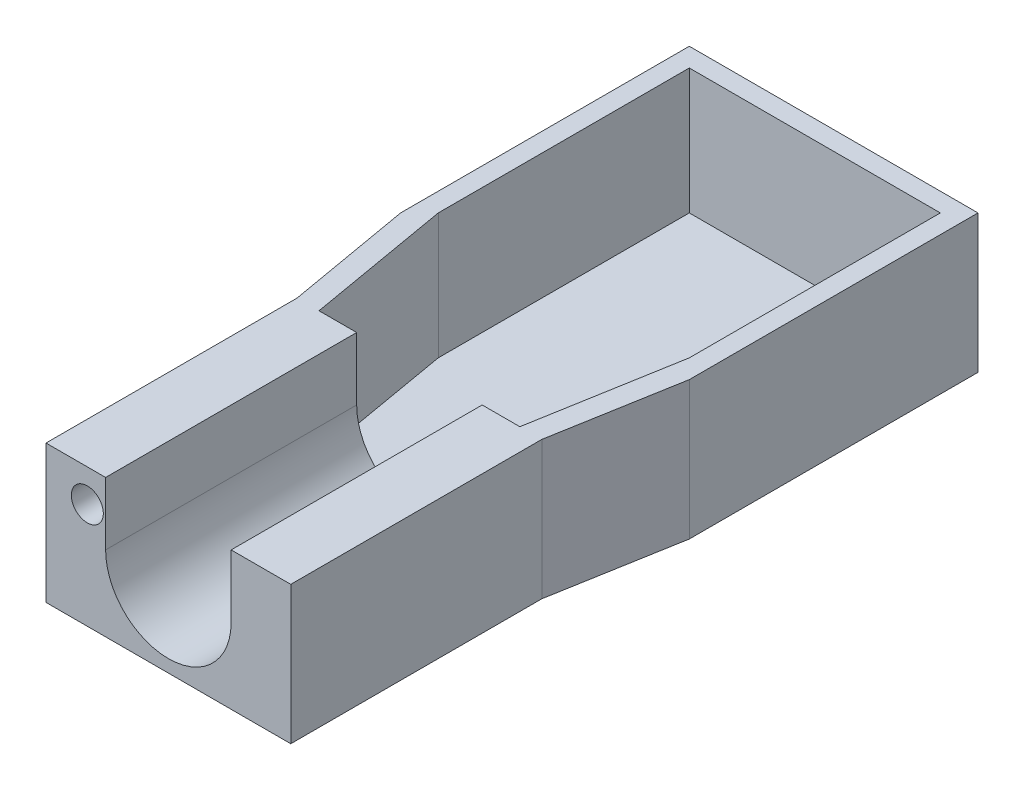
ISO-10303-21;
HEADER;
FILE_DESCRIPTION(('STEP AP214'),'2;1');
FILE_NAME('part.step','',(''),(''),'','','');
FILE_SCHEMA(('AUTOMOTIVE_DESIGN { 1 0 10303 214 1 1 1 1 }'));
ENDSEC;
DATA;
#1=APPLICATION_CONTEXT('core data for automotive mechanical design processes');
#2=APPLICATION_PROTOCOL_DEFINITION('international standard','automotive_design',2000,#1);
#3=PRODUCT_CONTEXT('',#1,'mechanical');
#4=PRODUCT('Part','Part','',(#3));
#5=PRODUCT_RELATED_PRODUCT_CATEGORY('part','',(#4));
#6=PRODUCT_DEFINITION_FORMATION('','',#4);
#7=PRODUCT_DEFINITION_CONTEXT('part definition',#1,'design');
#8=PRODUCT_DEFINITION('design','',#6,#7);
#9=PRODUCT_DEFINITION_SHAPE('','',#8);
#10=(LENGTH_UNIT() NAMED_UNIT(*) SI_UNIT(.MILLI.,.METRE.));
#11=(NAMED_UNIT(*) PLANE_ANGLE_UNIT() SI_UNIT($,.RADIAN.));
#12=(NAMED_UNIT(*) SI_UNIT($,.STERADIAN.) SOLID_ANGLE_UNIT());
#13=UNCERTAINTY_MEASURE_WITH_UNIT(LENGTH_MEASURE(1.E-05),#10,'distance_accuracy_value','');
#14=(GEOMETRIC_REPRESENTATION_CONTEXT(3) GLOBAL_UNCERTAINTY_ASSIGNED_CONTEXT((#13)) GLOBAL_UNIT_ASSIGNED_CONTEXT((#10,
#11,#12)) REPRESENTATION_CONTEXT('',''));
#15=CARTESIAN_POINT('',(0.,0.,0.));
#16=DIRECTION('',(0.,0.,1.));
#17=DIRECTION('',(1.,0.,0.));
#18=AXIS2_PLACEMENT_3D('',#15,#16,#17);
#19=CARTESIAN_POINT('',(0.,0.,0.));
#20=DIRECTION('',(0.,1.,0.));
#21=DIRECTION('',(0.,0.,1.));
#22=AXIS2_PLACEMENT_3D('',#19,#20,#21);
#23=PLANE('',#22);
#24=DIRECTION('',(0.171341174751248,0.,0.985211754819675));
#25=VECTOR('',#24,1.);
#26=CARTESIAN_POINT('',(-22.7889908256881,0.,3.96330275229359));
#27=LINE('',#26,#25);
#28=CARTESIAN_POINT('',(-20.,0.,20.));
#29=VERTEX_POINT('',#28);
#30=CARTESIAN_POINT('',(-16.,0.,43.));
#31=VERTEX_POINT('',#30);
#32=EDGE_CURVE('E186',#29,#31,#27,.T.);
#33=ORIENTED_EDGE('',*,*,#32,.T.);
#34=DIRECTION('',(-1.,0.,0.));
#35=VECTOR('',#34,1.);
#36=CARTESIAN_POINT('',(16.,0.,43.));
#37=LINE('',#36,#35);
#38=CARTESIAN_POINT('',(1.59588101442073E-12,0.,43.));
#39=VERTEX_POINT('',#38);
#40=EDGE_CURVE('E51',#39,#31,#37,.T.);
#41=ORIENTED_EDGE('',*,*,#40,.F.);
#42=CARTESIAN_POINT('',(16.,0.,43.));
#43=VERTEX_POINT('',#42);
#44=EDGE_CURVE('E163',#43,#39,#37,.T.);
#45=ORIENTED_EDGE('',*,*,#44,.F.);
#46=DIRECTION('',(-0.171341174751247,0.,0.985211754819675));
#47=VECTOR('',#46,1.);
#48=CARTESIAN_POINT('',(22.7889908256881,0.,3.96330275229357));
#49=LINE('',#48,#47);
#50=CARTESIAN_POINT('',(20.,0.,20.));
#51=VERTEX_POINT('',#50);
#52=EDGE_CURVE('E167',#51,#43,#49,.T.);
#53=ORIENTED_EDGE('',*,*,#52,.F.);
#54=DIRECTION('',(0.,0.,-1.));
#55=VECTOR('',#54,1.);
#56=CARTESIAN_POINT('',(20.,0.,-20.));
#57=LINE('',#56,#55);
#58=CARTESIAN_POINT('',(20.,0.,-20.));
#59=VERTEX_POINT('',#58);
#60=EDGE_CURVE('E220',#51,#59,#57,.T.);
#61=ORIENTED_EDGE('',*,*,#60,.T.);
#62=DIRECTION('',(-1.,0.,0.));
#63=VECTOR('',#62,1.);
#64=CARTESIAN_POINT('',(-20.,0.,-20.));
#65=LINE('',#64,#63);
#66=CARTESIAN_POINT('',(-20.,0.,-20.));
#67=VERTEX_POINT('',#66);
#68=EDGE_CURVE('E230',#59,#67,#65,.T.);
#69=ORIENTED_EDGE('',*,*,#68,.T.);
#70=DIRECTION('',(0.,0.,1.));
#71=VECTOR('',#70,1.);
#72=CARTESIAN_POINT('',(-20.,0.,-20.));
#73=LINE('',#72,#71);
#74=EDGE_CURVE('E224',#67,#29,#73,.T.);
#75=ORIENTED_EDGE('',*,*,#74,.T.);
#76=EDGE_LOOP('',(#33,#41,#45,#53,#61,#69,#75));
#77=FACE_BOUND('',#76,.T.);
#78=ADVANCED_FACE('F36',(#77),#23,.T.);
#79=CARTESIAN_POINT('',(-22.7889908256881,-2.,3.96330275229359));
#80=DIRECTION('',(-0.985211754819675,0.,0.171341174751248));
#81=DIRECTION('',(0.171341174751248,0.,0.985211754819674));
#82=AXIS2_PLACEMENT_3D('',#79,#80,#81);
#83=PLANE('',#82);
#84=DIRECTION('',(0.,1.,0.));
#85=VECTOR('',#84,1.);
#86=CARTESIAN_POINT('',(-16.,-2.,43.));
#87=LINE('',#86,#85);
#88=CARTESIAN_POINT('',(-16.,20.,43.));
#89=VERTEX_POINT('',#88);
#90=EDGE_CURVE('E207',#31,#89,#87,.T.);
#91=ORIENTED_EDGE('',*,*,#90,.F.);
#92=ORIENTED_EDGE('',*,*,#32,.F.);
#93=DIRECTION('',(0.,-1.,0.));
#94=VECTOR('',#93,1.);
#95=CARTESIAN_POINT('',(-20.,20.,20.));
#96=LINE('',#95,#94);
#97=CARTESIAN_POINT('',(-20.,20.,20.));
#98=VERTEX_POINT('',#97);
#99=EDGE_CURVE('E236',#98,#29,#96,.T.);
#100=ORIENTED_EDGE('',*,*,#99,.F.);
#101=DIRECTION('',(0.171341174751248,0.,0.985211754819675));
#102=VECTOR('',#101,1.);
#103=CARTESIAN_POINT('',(-22.7889908256881,20.,3.96330275229359));
#104=LINE('',#103,#102);
#105=EDGE_CURVE('E203',#98,#89,#104,.T.);
#106=ORIENTED_EDGE('',*,*,#105,.T.);
#107=EDGE_LOOP('',(#91,#92,#100,#106));
#108=FACE_BOUND('',#107,.T.);
#109=ADVANCED_FACE('F310',(#108),#83,.F.);
#110=CARTESIAN_POINT('',(22.7889908256881,-2.,3.96330275229357));
#111=DIRECTION('',(-0.985211754819675,0.,-0.171341174751247));
#112=DIRECTION('',(-0.171341174751247,0.,0.985211754819675));
#113=AXIS2_PLACEMENT_3D('',#110,#111,#112);
#114=PLANE('',#113);
#115=ORIENTED_EDGE('',*,*,#52,.T.);
#116=DIRECTION('',(0.,1.,0.));
#117=VECTOR('',#116,1.);
#118=CARTESIAN_POINT('',(16.,-2.,43.));
#119=LINE('',#118,#117);
#120=CARTESIAN_POINT('',(16.,20.,43.));
#121=VERTEX_POINT('',#120);
#122=EDGE_CURVE('E173',#43,#121,#119,.T.);
#123=ORIENTED_EDGE('',*,*,#122,.T.);
#124=DIRECTION('',(-0.171341174751247,0.,0.985211754819675));
#125=VECTOR('',#124,1.);
#126=CARTESIAN_POINT('',(22.7889908256881,20.,3.96330275229357));
#127=LINE('',#126,#125);
#128=CARTESIAN_POINT('',(20.,20.,20.));
#129=VERTEX_POINT('',#128);
#130=EDGE_CURVE('E194',#129,#121,#127,.T.);
#131=ORIENTED_EDGE('',*,*,#130,.F.);
#132=DIRECTION('',(0.,-1.,0.));
#133=VECTOR('',#132,1.);
#134=CARTESIAN_POINT('',(20.,20.,20.));
#135=LINE('',#134,#133);
#136=EDGE_CURVE('E185',#129,#51,#135,.T.);
#137=ORIENTED_EDGE('',*,*,#136,.T.);
#138=EDGE_LOOP('',(#115,#123,#131,#137));
#139=FACE_BOUND('',#138,.T.);
#140=ADVANCED_FACE('F183',(#139),#114,.T.);
#141=CARTESIAN_POINT('',(0.,20.,0.));
#142=DIRECTION('',(0.,1.,0.));
#143=DIRECTION('',(0.,0.,1.));
#144=AXIS2_PLACEMENT_3D('',#141,#142,#143);
#145=PLANE('',#144);
#146=DIRECTION('',(0.,0.,-1.));
#147=VECTOR('',#146,1.);
#148=CARTESIAN_POINT('',(20.,20.,-20.));
#149=LINE('',#148,#147);
#150=CARTESIAN_POINT('',(20.,20.,-20.));
#151=VERTEX_POINT('',#150);
#152=EDGE_CURVE('E221',#129,#151,#149,.T.);
#153=ORIENTED_EDGE('',*,*,#152,.F.);
#154=ORIENTED_EDGE('',*,*,#130,.T.);
#155=DIRECTION('',(1.,0.,0.));
#156=VECTOR('',#155,1.);
#157=CARTESIAN_POINT('',(0.,20.,43.));
#158=LINE('',#157,#156);
#159=CARTESIAN_POINT('',(10.,20.,43.));
#160=VERTEX_POINT('',#159);
#161=EDGE_CURVE('E177',#160,#121,#158,.T.);
#162=ORIENTED_EDGE('',*,*,#161,.F.);
#163=DIRECTION('',(0.,0.,-1.));
#164=VECTOR('',#163,1.);
#165=CARTESIAN_POINT('',(10.,20.,83.));
#166=LINE('',#165,#164);
#167=CARTESIAN_POINT('',(10.,20.,83.));
#168=VERTEX_POINT('',#167);
#169=EDGE_CURVE('E282',#168,#160,#166,.T.);
#170=ORIENTED_EDGE('',*,*,#169,.F.);
#171=DIRECTION('',(1.,0.,0.));
#172=VECTOR('',#171,1.);
#173=CARTESIAN_POINT('',(0.,20.,83.));
#174=LINE('',#173,#172);
#175=CARTESIAN_POINT('',(19.5,20.,83.));
#176=VERTEX_POINT('',#175);
#177=EDGE_CURVE('E277',#168,#176,#174,.T.);
#178=ORIENTED_EDGE('',*,*,#177,.T.);
#179=DIRECTION('',(0.,0.,-1.));
#180=VECTOR('',#179,1.);
#181=CARTESIAN_POINT('',(19.5,20.,83.));
#182=LINE('',#181,#180);
#183=CARTESIAN_POINT('',(19.5,20.,43.));
#184=VERTEX_POINT('',#183);
#185=EDGE_CURVE('E275',#176,#184,#182,.T.);
#186=ORIENTED_EDGE('',*,*,#185,.T.);
#187=DIRECTION('',(0.172380331752248,0.,-0.985030467155704));
#188=VECTOR('',#187,1.);
#189=CARTESIAN_POINT('',(26.2219526986052,20.,4.58884172225589));
#190=LINE('',#189,#188);
#191=CARTESIAN_POINT('',(23.,20.,23.));
#192=VERTEX_POINT('',#191);
#193=EDGE_CURVE('E188',#184,#192,#190,.T.);
#194=ORIENTED_EDGE('',*,*,#193,.T.);
#195=DIRECTION('',(0.,0.,-1.));
#196=VECTOR('',#195,1.);
#197=CARTESIAN_POINT('',(23.,20.,-23.));
#198=LINE('',#197,#196);
#199=CARTESIAN_POINT('',(23.,20.,-23.));
#200=VERTEX_POINT('',#199);
#201=EDGE_CURVE('E244',#192,#200,#198,.T.);
#202=ORIENTED_EDGE('',*,*,#201,.T.);
#203=DIRECTION('',(-1.,0.,0.));
#204=VECTOR('',#203,1.);
#205=CARTESIAN_POINT('',(-23.,20.,-23.));
#206=LINE('',#205,#204);
#207=CARTESIAN_POINT('',(-23.,20.,-23.));
#208=VERTEX_POINT('',#207);
#209=EDGE_CURVE('E247',#200,#208,#206,.T.);
#210=ORIENTED_EDGE('',*,*,#209,.T.);
#211=DIRECTION('',(0.,0.,1.));
#212=VECTOR('',#211,1.);
#213=CARTESIAN_POINT('',(-23.,20.,-23.));
#214=LINE('',#213,#212);
#215=CARTESIAN_POINT('',(-23.,20.,23.));
#216=VERTEX_POINT('',#215);
#217=EDGE_CURVE('E59',#208,#216,#214,.T.);
#218=ORIENTED_EDGE('',*,*,#217,.T.);
#219=DIRECTION('',(0.172380331752249,0.,0.985030467155704));
#220=VECTOR('',#219,1.);
#221=CARTESIAN_POINT('',(-26.2219526986052,20.,4.58884172225593));
#222=LINE('',#221,#220);
#223=CARTESIAN_POINT('',(-19.5,20.,43.));
#224=VERTEX_POINT('',#223);
#225=EDGE_CURVE('E180',#216,#224,#222,.T.);
#226=ORIENTED_EDGE('',*,*,#225,.T.);
#227=DIRECTION('',(0.,0.,-1.));
#228=VECTOR('',#227,1.);
#229=CARTESIAN_POINT('',(-19.5,20.,83.));
#230=LINE('',#229,#228);
#231=CARTESIAN_POINT('',(-19.5,20.,83.));
#232=VERTEX_POINT('',#231);
#233=EDGE_CURVE('E293',#232,#224,#230,.T.);
#234=ORIENTED_EDGE('',*,*,#233,.F.);
#235=DIRECTION('',(-1.,0.,0.));
#236=VECTOR('',#235,1.);
#237=CARTESIAN_POINT('',(0.,20.,83.));
#238=LINE('',#237,#236);
#239=CARTESIAN_POINT('',(-9.99999999999787,20.,83.));
#240=VERTEX_POINT('',#239);
#241=EDGE_CURVE('E351',#240,#232,#238,.T.);
#242=ORIENTED_EDGE('',*,*,#241,.F.);
#243=DIRECTION('',(0.,0.,-1.));
#244=VECTOR('',#243,1.);
#245=CARTESIAN_POINT('',(-9.99999999999787,20.,83.));
#246=LINE('',#245,#244);
#247=CARTESIAN_POINT('',(-9.99999999999787,20.,43.));
#248=VERTEX_POINT('',#247);
#249=EDGE_CURVE('E296',#240,#248,#246,.T.);
#250=ORIENTED_EDGE('',*,*,#249,.T.);
#251=DIRECTION('',(-1.,0.,0.));
#252=VECTOR('',#251,1.);
#253=CARTESIAN_POINT('',(0.,20.,43.));
#254=LINE('',#253,#252);
#255=EDGE_CURVE('E318',#248,#89,#254,.T.);
#256=ORIENTED_EDGE('',*,*,#255,.T.);
#257=ORIENTED_EDGE('',*,*,#105,.F.);
#258=DIRECTION('',(0.,0.,1.));
#259=VECTOR('',#258,1.);
#260=CARTESIAN_POINT('',(-20.,20.,-20.));
#261=LINE('',#260,#259);
#262=CARTESIAN_POINT('',(-20.,20.,-20.));
#263=VERTEX_POINT('',#262);
#264=EDGE_CURVE('E226',#263,#98,#261,.T.);
#265=ORIENTED_EDGE('',*,*,#264,.F.);
#266=DIRECTION('',(-1.,0.,0.));
#267=VECTOR('',#266,1.);
#268=CARTESIAN_POINT('',(-20.,20.,-20.));
#269=LINE('',#268,#267);
#270=EDGE_CURVE('E223',#151,#263,#269,.T.);
#271=ORIENTED_EDGE('',*,*,#270,.F.);
#272=EDGE_LOOP('',(#153,#154,#162,#170,#178,#186,#194,#202,#210,#218,#226,#234,#242,#250,#256,
#257,#265,#271));
#273=FACE_BOUND('',#272,.T.);
#274=ADVANCED_FACE('F273',(#273),#145,.T.);
#275=CARTESIAN_POINT('',(23.,20.,-23.));
#276=DIRECTION('',(-1.,0.,0.));
#277=DIRECTION('',(0.,0.,1.));
#278=AXIS2_PLACEMENT_3D('',#275,#276,#277);
#279=PLANE('',#278);
#280=DIRECTION('',(0.,-1.,0.));
#281=VECTOR('',#280,1.);
#282=CARTESIAN_POINT('',(23.,20.,23.));
#283=LINE('',#282,#281);
#284=CARTESIAN_POINT('',(23.,-2.,23.));
#285=VERTEX_POINT('',#284);
#286=EDGE_CURVE('E250',#192,#285,#283,.T.);
#287=ORIENTED_EDGE('',*,*,#286,.T.);
#288=DIRECTION('',(0.,0.,1.));
#289=VECTOR('',#288,1.);
#290=CARTESIAN_POINT('',(23.,-2.,-23.));
#291=LINE('',#290,#289);
#292=CARTESIAN_POINT('',(23.,-2.,-23.));
#293=VERTEX_POINT('',#292);
#294=EDGE_CURVE('E217',#293,#285,#291,.T.);
#295=ORIENTED_EDGE('',*,*,#294,.F.);
#296=DIRECTION('',(0.,-1.,0.));
#297=VECTOR('',#296,1.);
#298=CARTESIAN_POINT('',(23.,20.,-23.));
#299=LINE('',#298,#297);
#300=EDGE_CURVE('E44',#200,#293,#299,.T.);
#301=ORIENTED_EDGE('',*,*,#300,.F.);
#302=ORIENTED_EDGE('',*,*,#201,.F.);
#303=EDGE_LOOP('',(#287,#295,#301,#302));
#304=FACE_BOUND('',#303,.T.);
#305=ADVANCED_FACE('F38',(#304),#279,.F.);
#306=CARTESIAN_POINT('',(-23.,20.,-23.));
#307=DIRECTION('',(0.,0.,1.));
#308=DIRECTION('',(1.,0.,0.));
#309=AXIS2_PLACEMENT_3D('',#306,#307,#308);
#310=PLANE('',#309);
#311=ORIENTED_EDGE('',*,*,#300,.T.);
#312=DIRECTION('',(1.,0.,0.));
#313=VECTOR('',#312,1.);
#314=CARTESIAN_POINT('',(-23.,-2.,-23.));
#315=LINE('',#314,#313);
#316=CARTESIAN_POINT('',(-23.,-2.,-23.));
#317=VERTEX_POINT('',#316);
#318=EDGE_CURVE('E214',#317,#293,#315,.T.);
#319=ORIENTED_EDGE('',*,*,#318,.F.);
#320=DIRECTION('',(0.,-1.,0.));
#321=VECTOR('',#320,1.);
#322=CARTESIAN_POINT('',(-23.,20.,-23.));
#323=LINE('',#322,#321);
#324=EDGE_CURVE('E256',#208,#317,#323,.T.);
#325=ORIENTED_EDGE('',*,*,#324,.F.);
#326=ORIENTED_EDGE('',*,*,#209,.F.);
#327=EDGE_LOOP('',(#311,#319,#325,#326));
#328=FACE_BOUND('',#327,.T.);
#329=ADVANCED_FACE('F260',(#328),#310,.F.);
#330=CARTESIAN_POINT('',(-23.,20.,-23.));
#331=DIRECTION('',(1.,0.,0.));
#332=DIRECTION('',(0.,0.,-1.));
#333=AXIS2_PLACEMENT_3D('',#330,#331,#332);
#334=PLANE('',#333);
#335=ORIENTED_EDGE('',*,*,#324,.T.);
#336=DIRECTION('',(0.,0.,-1.));
#337=VECTOR('',#336,1.);
#338=CARTESIAN_POINT('',(-23.,-2.,-23.));
#339=LINE('',#338,#337);
#340=CARTESIAN_POINT('',(-23.,-2.,23.));
#341=VERTEX_POINT('',#340);
#342=EDGE_CURVE('E210',#341,#317,#339,.T.);
#343=ORIENTED_EDGE('',*,*,#342,.F.);
#344=DIRECTION('',(0.,-1.,0.));
#345=VECTOR('',#344,1.);
#346=CARTESIAN_POINT('',(-23.,20.,23.));
#347=LINE('',#346,#345);
#348=EDGE_CURVE('E253',#216,#341,#347,.T.);
#349=ORIENTED_EDGE('',*,*,#348,.F.);
#350=ORIENTED_EDGE('',*,*,#217,.F.);
#351=EDGE_LOOP('',(#335,#343,#349,#350));
#352=FACE_BOUND('',#351,.T.);
#353=ADVANCED_FACE('F401',(#352),#334,.F.);
#354=CARTESIAN_POINT('',(20.,20.,-20.));
#355=DIRECTION('',(-1.,0.,0.));
#356=DIRECTION('',(0.,0.,1.));
#357=AXIS2_PLACEMENT_3D('',#354,#355,#356);
#358=PLANE('',#357);
#359=ORIENTED_EDGE('',*,*,#60,.F.);
#360=ORIENTED_EDGE('',*,*,#136,.F.);
#361=ORIENTED_EDGE('',*,*,#152,.T.);
#362=DIRECTION('',(0.,-1.,0.));
#363=VECTOR('',#362,1.);
#364=CARTESIAN_POINT('',(20.,20.,-20.));
#365=LINE('',#364,#363);
#366=EDGE_CURVE('E241',#151,#59,#365,.T.);
#367=ORIENTED_EDGE('',*,*,#366,.T.);
#368=EDGE_LOOP('',(#359,#360,#361,#367));
#369=FACE_BOUND('',#368,.T.);
#370=ADVANCED_FACE('F397',(#369),#358,.T.);
#371=CARTESIAN_POINT('',(-20.,20.,-20.));
#372=DIRECTION('',(0.,0.,1.));
#373=DIRECTION('',(1.,0.,0.));
#374=AXIS2_PLACEMENT_3D('',#371,#372,#373);
#375=PLANE('',#374);
#376=ORIENTED_EDGE('',*,*,#68,.F.);
#377=ORIENTED_EDGE('',*,*,#366,.F.);
#378=ORIENTED_EDGE('',*,*,#270,.T.);
#379=DIRECTION('',(0.,-1.,0.));
#380=VECTOR('',#379,1.);
#381=CARTESIAN_POINT('',(-20.,20.,-20.));
#382=LINE('',#381,#380);
#383=EDGE_CURVE('E239',#263,#67,#382,.T.);
#384=ORIENTED_EDGE('',*,*,#383,.T.);
#385=EDGE_LOOP('',(#376,#377,#378,#384));
#386=FACE_BOUND('',#385,.T.);
#387=ADVANCED_FACE('F394',(#386),#375,.T.);
#388=CARTESIAN_POINT('',(-20.,20.,-20.));
#389=DIRECTION('',(1.,0.,0.));
#390=DIRECTION('',(0.,0.,-1.));
#391=AXIS2_PLACEMENT_3D('',#388,#389,#390);
#392=PLANE('',#391);
#393=ORIENTED_EDGE('',*,*,#74,.F.);
#394=ORIENTED_EDGE('',*,*,#383,.F.);
#395=ORIENTED_EDGE('',*,*,#264,.T.);
#396=ORIENTED_EDGE('',*,*,#99,.T.);
#397=EDGE_LOOP('',(#393,#394,#395,#396));
#398=FACE_BOUND('',#397,.T.);
#399=ADVANCED_FACE('F315',(#398),#392,.T.);
#400=CARTESIAN_POINT('',(0.,-2.,0.));
#401=DIRECTION('',(0.,1.,0.));
#402=DIRECTION('',(0.,0.,1.));
#403=AXIS2_PLACEMENT_3D('',#400,#401,#402);
#404=PLANE('',#403);
#405=DIRECTION('',(0.172380331752248,0.,-0.985030467155704));
#406=VECTOR('',#405,1.);
#407=CARTESIAN_POINT('',(26.2219526986052,-2.,4.58884172225589));
#408=LINE('',#407,#406);
#409=CARTESIAN_POINT('',(19.5,-2.,43.));
#410=VERTEX_POINT('',#409);
#411=EDGE_CURVE('E192',#410,#285,#408,.T.);
#412=ORIENTED_EDGE('',*,*,#411,.F.);
#413=DIRECTION('',(0.,0.,-1.));
#414=VECTOR('',#413,1.);
#415=CARTESIAN_POINT('',(19.5,-2.,83.));
#416=LINE('',#415,#414);
#417=CARTESIAN_POINT('',(19.5,-2.,83.));
#418=VERTEX_POINT('',#417);
#419=EDGE_CURVE('E281',#418,#410,#416,.T.);
#420=ORIENTED_EDGE('',*,*,#419,.F.);
#421=DIRECTION('',(1.,0.,0.));
#422=VECTOR('',#421,1.);
#423=CARTESIAN_POINT('',(0.,-2.,83.));
#424=LINE('',#423,#422);
#425=CARTESIAN_POINT('',(-19.5,-2.,83.));
#426=VERTEX_POINT('',#425);
#427=EDGE_CURVE('E355',#426,#418,#424,.T.);
#428=ORIENTED_EDGE('',*,*,#427,.F.);
#429=DIRECTION('',(0.,0.,-1.));
#430=VECTOR('',#429,1.);
#431=CARTESIAN_POINT('',(-19.5,-2.,83.));
#432=LINE('',#431,#430);
#433=CARTESIAN_POINT('',(-19.5,-2.,43.));
#434=VERTEX_POINT('',#433);
#435=EDGE_CURVE('E285',#426,#434,#432,.T.);
#436=ORIENTED_EDGE('',*,*,#435,.T.);
#437=DIRECTION('',(0.172380331752249,0.,0.985030467155704));
#438=VECTOR('',#437,1.);
#439=CARTESIAN_POINT('',(-26.2219526986052,-2.,4.58884172225593));
#440=LINE('',#439,#438);
#441=EDGE_CURVE('E200',#341,#434,#440,.T.);
#442=ORIENTED_EDGE('',*,*,#441,.F.);
#443=ORIENTED_EDGE('',*,*,#342,.T.);
#444=ORIENTED_EDGE('',*,*,#318,.T.);
#445=ORIENTED_EDGE('',*,*,#294,.T.);
#446=EDGE_LOOP('',(#412,#420,#428,#436,#442,#443,#444,#445));
#447=FACE_BOUND('',#446,.T.);
#448=ADVANCED_FACE('F267',(#447),#404,.F.);
#449=CARTESIAN_POINT('',(-26.2219526986052,-2.,4.58884172225593));
#450=DIRECTION('',(-0.985030467155704,0.,0.172380331752249));
#451=DIRECTION('',(0.172380331752249,0.,0.985030467155704));
#452=AXIS2_PLACEMENT_3D('',#449,#450,#451);
#453=PLANE('',#452);
#454=ORIENTED_EDGE('',*,*,#225,.F.);
#455=ORIENTED_EDGE('',*,*,#348,.T.);
#456=ORIENTED_EDGE('',*,*,#441,.T.);
#457=DIRECTION('',(0.,1.,0.));
#458=VECTOR('',#457,1.);
#459=CARTESIAN_POINT('',(-19.5,-2.,43.));
#460=LINE('',#459,#458);
#461=EDGE_CURVE('E202',#434,#224,#460,.T.);
#462=ORIENTED_EDGE('',*,*,#461,.T.);
#463=EDGE_LOOP('',(#454,#455,#456,#462));
#464=FACE_BOUND('',#463,.T.);
#465=ADVANCED_FACE('F370',(#464),#453,.T.);
#466=CARTESIAN_POINT('',(26.2219526986052,-2.,4.58884172225589));
#467=DIRECTION('',(0.985030467155704,0.,0.172380331752248));
#468=DIRECTION('',(0.172380331752248,0.,-0.985030467155704));
#469=AXIS2_PLACEMENT_3D('',#466,#467,#468);
#470=PLANE('',#469);
#471=ORIENTED_EDGE('',*,*,#193,.F.);
#472=DIRECTION('',(0.,1.,0.));
#473=VECTOR('',#472,1.);
#474=CARTESIAN_POINT('',(19.5,-2.,43.));
#475=LINE('',#474,#473);
#476=EDGE_CURVE('E181',#410,#184,#475,.T.);
#477=ORIENTED_EDGE('',*,*,#476,.F.);
#478=ORIENTED_EDGE('',*,*,#411,.T.);
#479=ORIENTED_EDGE('',*,*,#286,.F.);
#480=EDGE_LOOP('',(#471,#477,#478,#479));
#481=FACE_BOUND('',#480,.T.);
#482=ADVANCED_FACE('F270',(#481),#470,.T.);
#483=CARTESIAN_POINT('',(0.,0.,43.));
#484=DIRECTION('',(0.,0.,1.));
#485=DIRECTION('',(1.,0.,0.));
#486=AXIS2_PLACEMENT_3D('',#483,#484,#485);
#487=PLANE('',#486);
#488=ORIENTED_EDGE('',*,*,#161,.T.);
#489=ORIENTED_EDGE('',*,*,#122,.F.);
#490=ORIENTED_EDGE('',*,*,#44,.T.);
#491=CARTESIAN_POINT('',(1.59588101442073E-12,10.0000000000005,43.));
#492=DIRECTION('',(0.,0.,1.));
#493=DIRECTION('',(1.,0.,0.));
#494=AXIS2_PLACEMENT_3D('',#491,#492,#493);
#495=CIRCLE('',#494,10.0000000000007);
#496=CARTESIAN_POINT('',(10.0000000000019,10.0000000000011,43.));
#497=VERTEX_POINT('',#496);
#498=EDGE_CURVE('E341',#39,#497,#495,.T.);
#499=ORIENTED_EDGE('',*,*,#498,.T.);
#500=DIRECTION('',(-1.86829718362722E-13,1.,0.));
#501=VECTOR('',#500,1.);
#502=CARTESIAN_POINT('',(10.0000000000037,1.86829718362792E-12,43.));
#503=LINE('',#502,#501);
#504=EDGE_CURVE('E323',#497,#160,#503,.T.);
#505=ORIENTED_EDGE('',*,*,#504,.T.);
#506=EDGE_LOOP('',(#488,#489,#490,#499,#505));
#507=FACE_BOUND('',#506,.T.);
#508=ADVANCED_FACE('F174',(#507),#487,.F.);
#509=CARTESIAN_POINT('',(-12.9143775376112,14.8277824210989,43.));
#510=DIRECTION('',(0.,0.,1.));
#511=DIRECTION('',(1.,0.,0.));
#512=AXIS2_PLACEMENT_3D('',#509,#510,#511);
#513=CIRCLE('',#512,2.55);
#514=CARTESIAN_POINT('',(-10.3643775376112,14.8277824210989,43.));
#515=VERTEX_POINT('',#514);
#516=EDGE_CURVE('E342',#515,#515,#513,.T.);
#517=ORIENTED_EDGE('',*,*,#516,.T.);
#518=EDGE_LOOP('',(#517));
#519=FACE_BOUND('',#518,.T.);
#520=ORIENTED_EDGE('',*,*,#40,.T.);
#521=ORIENTED_EDGE('',*,*,#90,.T.);
#522=ORIENTED_EDGE('',*,*,#255,.F.);
#523=DIRECTION('',(1.87176663057907E-13,1.,0.));
#524=VECTOR('',#523,1.);
#525=CARTESIAN_POINT('',(-10.0000000000016,1.87176663057938E-12,43.));
#526=LINE('',#525,#524);
#527=CARTESIAN_POINT('',(-9.99999999999975,10.0000000000005,43.));
#528=VERTEX_POINT('',#527);
#529=EDGE_CURVE('E321',#528,#248,#526,.T.);
#530=ORIENTED_EDGE('',*,*,#529,.F.);
#531=EDGE_CURVE('E308',#528,#39,#495,.T.);
#532=ORIENTED_EDGE('',*,*,#531,.T.);
#533=EDGE_LOOP('',(#520,#521,#522,#530,#532));
#534=FACE_BOUND('',#533,.T.);
#535=ADVANCED_FACE('F305',(#519,#534),#487,.F.);
#536=CARTESIAN_POINT('',(1.59588101442073E-12,10.0000000000005,83.));
#537=DIRECTION('',(0.,0.,-1.));
#538=DIRECTION('',(-1.,0.,0.));
#539=AXIS2_PLACEMENT_3D('',#536,#537,#538);
#540=CYLINDRICAL_SURFACE('',#539,10.0000000000007);
#541=ORIENTED_EDGE('',*,*,#531,.F.);
#542=DIRECTION('',(0.,0.,-1.));
#543=VECTOR('',#542,1.);
#544=CARTESIAN_POINT('',(-9.99999999999975,10.0000000000005,83.));
#545=LINE('',#544,#543);
#546=CARTESIAN_POINT('',(-9.99999999999975,10.0000000000005,83.));
#547=VERTEX_POINT('',#546);
#548=EDGE_CURVE('E298',#547,#528,#545,.T.);
#549=ORIENTED_EDGE('',*,*,#548,.F.);
#550=CARTESIAN_POINT('',(1.59588101442073E-12,10.0000000000005,83.));
#551=DIRECTION('',(0.,0.,1.));
#552=DIRECTION('',(1.,0.,0.));
#553=AXIS2_PLACEMENT_3D('',#550,#551,#552);
#554=CIRCLE('',#553,10.0000000000007);
#555=CARTESIAN_POINT('',(10.0000000000019,10.0000000000011,83.));
#556=VERTEX_POINT('',#555);
#557=EDGE_CURVE('E328',#547,#556,#554,.T.);
#558=ORIENTED_EDGE('',*,*,#557,.T.);
#559=DIRECTION('',(0.,0.,-1.));
#560=VECTOR('',#559,1.);
#561=CARTESIAN_POINT('',(10.0000000000019,10.0000000000011,83.));
#562=LINE('',#561,#560);
#563=EDGE_CURVE('E287',#556,#497,#562,.T.);
#564=ORIENTED_EDGE('',*,*,#563,.T.);
#565=ORIENTED_EDGE('',*,*,#498,.F.);
#566=EDGE_LOOP('',(#541,#549,#558,#564,#565));
#567=FACE_BOUND('',#566,.T.);
#568=ADVANCED_FACE('F373',(#567),#540,.F.);
#569=CARTESIAN_POINT('',(-10.0000000000016,1.87176663057938E-12,83.));
#570=DIRECTION('',(-1.,1.87176663057908E-13,0.));
#571=DIRECTION('',(-1.87176663057908E-13,-1.,0.));
#572=AXIS2_PLACEMENT_3D('',#569,#570,#571);
#573=PLANE('',#572);
#574=ORIENTED_EDGE('',*,*,#529,.T.);
#575=ORIENTED_EDGE('',*,*,#249,.F.);
#576=DIRECTION('',(1.87176663057907E-13,1.,0.));
#577=VECTOR('',#576,1.);
#578=CARTESIAN_POINT('',(-10.0000000000016,1.87176663057938E-12,83.));
#579=LINE('',#578,#577);
#580=EDGE_CURVE('E349',#547,#240,#579,.T.);
#581=ORIENTED_EDGE('',*,*,#580,.F.);
#582=ORIENTED_EDGE('',*,*,#548,.T.);
#583=EDGE_LOOP('',(#574,#575,#581,#582));
#584=FACE_BOUND('',#583,.T.);
#585=ADVANCED_FACE('F372',(#584),#573,.F.);
#586=CARTESIAN_POINT('',(-19.5,0.,83.));
#587=DIRECTION('',(1.,0.,0.));
#588=DIRECTION('',(0.,0.,-1.));
#589=AXIS2_PLACEMENT_3D('',#586,#587,#588);
#590=PLANE('',#589);
#591=ORIENTED_EDGE('',*,*,#461,.F.);
#592=ORIENTED_EDGE('',*,*,#435,.F.);
#593=DIRECTION('',(0.,-1.,0.));
#594=VECTOR('',#593,1.);
#595=CARTESIAN_POINT('',(-19.5,0.,83.));
#596=LINE('',#595,#594);
#597=EDGE_CURVE('E353',#232,#426,#596,.T.);
#598=ORIENTED_EDGE('',*,*,#597,.F.);
#599=ORIENTED_EDGE('',*,*,#233,.T.);
#600=EDGE_LOOP('',(#591,#592,#598,#599));
#601=FACE_BOUND('',#600,.T.);
#602=ADVANCED_FACE('F366',(#601),#590,.F.);
#603=CARTESIAN_POINT('',(19.5,0.,83.));
#604=DIRECTION('',(-1.,0.,0.));
#605=DIRECTION('',(0.,0.,1.));
#606=AXIS2_PLACEMENT_3D('',#603,#604,#605);
#607=PLANE('',#606);
#608=ORIENTED_EDGE('',*,*,#476,.T.);
#609=ORIENTED_EDGE('',*,*,#185,.F.);
#610=DIRECTION('',(0.,1.,0.));
#611=VECTOR('',#610,1.);
#612=CARTESIAN_POINT('',(19.5,0.,83.));
#613=LINE('',#612,#611);
#614=EDGE_CURVE('E338',#418,#176,#613,.T.);
#615=ORIENTED_EDGE('',*,*,#614,.F.);
#616=ORIENTED_EDGE('',*,*,#419,.T.);
#617=EDGE_LOOP('',(#608,#609,#615,#616));
#618=FACE_BOUND('',#617,.T.);
#619=ADVANCED_FACE('F361',(#618),#607,.F.);
#620=CARTESIAN_POINT('',(10.0000000000037,1.86829718362792E-12,83.));
#621=DIRECTION('',(-1.,-1.86829718362722E-13,0.));
#622=DIRECTION('',(1.86829718362722E-13,-1.,0.));
#623=AXIS2_PLACEMENT_3D('',#620,#621,#622);
#624=PLANE('',#623);
#625=ORIENTED_EDGE('',*,*,#504,.F.);
#626=ORIENTED_EDGE('',*,*,#563,.F.);
#627=DIRECTION('',(-1.86829718362722E-13,1.,0.));
#628=VECTOR('',#627,1.);
#629=CARTESIAN_POINT('',(10.0000000000037,1.86829718362792E-12,83.));
#630=LINE('',#629,#628);
#631=EDGE_CURVE('E330',#556,#168,#630,.T.);
#632=ORIENTED_EDGE('',*,*,#631,.T.);
#633=ORIENTED_EDGE('',*,*,#169,.T.);
#634=EDGE_LOOP('',(#625,#626,#632,#633));
#635=FACE_BOUND('',#634,.T.);
#636=ADVANCED_FACE('F442',(#635),#624,.T.);
#637=CARTESIAN_POINT('',(0.,0.,83.));
#638=DIRECTION('',(0.,0.,1.));
#639=DIRECTION('',(1.,0.,0.));
#640=AXIS2_PLACEMENT_3D('',#637,#638,#639);
#641=PLANE('',#640);
#642=ORIENTED_EDGE('',*,*,#241,.T.);
#643=ORIENTED_EDGE('',*,*,#597,.T.);
#644=ORIENTED_EDGE('',*,*,#427,.T.);
#645=ORIENTED_EDGE('',*,*,#614,.T.);
#646=ORIENTED_EDGE('',*,*,#177,.F.);
#647=ORIENTED_EDGE('',*,*,#631,.F.);
#648=ORIENTED_EDGE('',*,*,#557,.F.);
#649=ORIENTED_EDGE('',*,*,#580,.T.);
#650=EDGE_LOOP('',(#642,#643,#644,#645,#646,#647,#648,#649));
#651=FACE_BOUND('',#650,.T.);
#652=CARTESIAN_POINT('',(-12.9143775376112,14.8277824210989,83.));
#653=DIRECTION('',(0.,0.,1.));
#654=DIRECTION('',(1.,0.,0.));
#655=AXIS2_PLACEMENT_3D('',#652,#653,#654);
#656=CIRCLE('',#655,2.55);
#657=CARTESIAN_POINT('',(-10.3643775376112,14.8277824210989,83.));
#658=VERTEX_POINT('',#657);
#659=EDGE_CURVE('E11',#658,#658,#656,.T.);
#660=ORIENTED_EDGE('',*,*,#659,.F.);
#661=EDGE_LOOP('',(#660));
#662=FACE_BOUND('',#661,.T.);
#663=ADVANCED_FACE('F357',(#651,#662),#641,.T.);
#664=CARTESIAN_POINT('',(-12.9143775376112,14.8277824210989,23.));
#665=DIRECTION('',(0.,0.,1.));
#666=DIRECTION('',(1.,0.,0.));
#667=AXIS2_PLACEMENT_3D('',#664,#665,#666);
#668=CYLINDRICAL_SURFACE('',#667,2.55);
#669=ORIENTED_EDGE('',*,*,#516,.F.);
#670=EDGE_LOOP('',(#669));
#671=FACE_BOUND('',#670,.T.);
#672=ORIENTED_EDGE('',*,*,#659,.T.);
#673=EDGE_LOOP('',(#672));
#674=FACE_BOUND('',#673,.T.);
#675=ADVANCED_FACE('F559',(#671,#674),#668,.F.);
#676=CLOSED_SHELL('',(#78,#109,#140,#274,#305,#329,#353,#370,#387,#399,#448,#465,#482,#508,#535,
#568,#585,#602,#619,#636,#663,#675));
#677=MANIFOLD_SOLID_BREP('B2',#676);
#678=ADVANCED_BREP_SHAPE_REPRESENTATION('',(#18,#677),#14);
#679=SHAPE_DEFINITION_REPRESENTATION(#9,#678);
ENDSEC;
END-ISO-10303-21;
